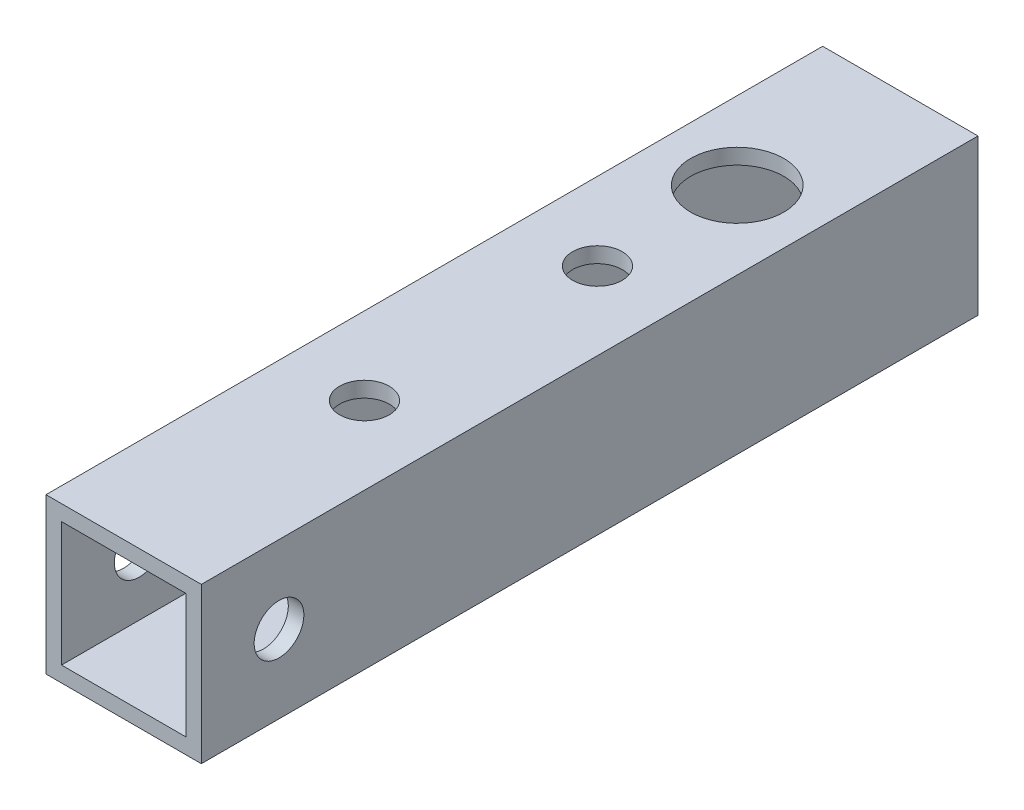
ISO-10303-21;
HEADER;
FILE_DESCRIPTION(('STEP AP214'),'2;1');
FILE_NAME('part.step','',(''),(''),'','','');
FILE_SCHEMA(('AUTOMOTIVE_DESIGN { 1 0 10303 214 1 1 1 1 }'));
ENDSEC;
DATA;
#1=APPLICATION_CONTEXT('core data for automotive mechanical design processes');
#2=APPLICATION_PROTOCOL_DEFINITION('international standard','automotive_design',2000,#1);
#3=PRODUCT_CONTEXT('',#1,'mechanical');
#4=PRODUCT('Part','Part','',(#3));
#5=PRODUCT_RELATED_PRODUCT_CATEGORY('part','',(#4));
#6=PRODUCT_DEFINITION_FORMATION('','',#4);
#7=PRODUCT_DEFINITION_CONTEXT('part definition',#1,'design');
#8=PRODUCT_DEFINITION('design','',#6,#7);
#9=PRODUCT_DEFINITION_SHAPE('','',#8);
#10=(LENGTH_UNIT() NAMED_UNIT(*) SI_UNIT(.MILLI.,.METRE.));
#11=(NAMED_UNIT(*) PLANE_ANGLE_UNIT() SI_UNIT($,.RADIAN.));
#12=(NAMED_UNIT(*) SI_UNIT($,.STERADIAN.) SOLID_ANGLE_UNIT());
#13=UNCERTAINTY_MEASURE_WITH_UNIT(LENGTH_MEASURE(1.E-05),#10,'distance_accuracy_value','');
#14=(GEOMETRIC_REPRESENTATION_CONTEXT(3) GLOBAL_UNCERTAINTY_ASSIGNED_CONTEXT((#13)) GLOBAL_UNIT_ASSIGNED_CONTEXT((#10,
#11,#12)) REPRESENTATION_CONTEXT('',''));
#15=CARTESIAN_POINT('',(0.,0.,0.));
#16=DIRECTION('',(0.,0.,1.));
#17=DIRECTION('',(1.,0.,0.));
#18=AXIS2_PLACEMENT_3D('',#15,#16,#17);
#19=CARTESIAN_POINT('',(0.,0.,50.));
#20=DIRECTION('',(0.,0.,1.));
#21=DIRECTION('',(1.,0.,0.));
#22=AXIS2_PLACEMENT_3D('',#19,#20,#21);
#23=PLANE('',#22);
#24=DIRECTION('',(0.,-1.,0.));
#25=VECTOR('',#24,1.);
#26=CARTESIAN_POINT('',(0.,0.,50.));
#27=LINE('',#26,#25);
#28=CARTESIAN_POINT('',(0.,10.,50.));
#29=VERTEX_POINT('',#28);
#30=CARTESIAN_POINT('',(0.,0.,50.));
#31=VERTEX_POINT('',#30);
#32=EDGE_CURVE('E163',#29,#31,#27,.T.);
#33=ORIENTED_EDGE('',*,*,#32,.T.);
#34=DIRECTION('',(1.,0.,0.));
#35=VECTOR('',#34,1.);
#36=CARTESIAN_POINT('',(0.,0.,50.));
#37=LINE('',#36,#35);
#38=CARTESIAN_POINT('',(10.,0.,50.));
#39=VERTEX_POINT('',#38);
#40=EDGE_CURVE('E166',#31,#39,#37,.T.);
#41=ORIENTED_EDGE('',*,*,#40,.T.);
#42=DIRECTION('',(0.,1.,0.));
#43=VECTOR('',#42,1.);
#44=CARTESIAN_POINT('',(10.,0.,50.));
#45=LINE('',#44,#43);
#46=CARTESIAN_POINT('',(10.,10.,50.));
#47=VERTEX_POINT('',#46);
#48=EDGE_CURVE('E169',#39,#47,#45,.T.);
#49=ORIENTED_EDGE('',*,*,#48,.T.);
#50=DIRECTION('',(-1.,0.,0.));
#51=VECTOR('',#50,1.);
#52=CARTESIAN_POINT('',(0.,10.,50.));
#53=LINE('',#52,#51);
#54=EDGE_CURVE('E171',#47,#29,#53,.T.);
#55=ORIENTED_EDGE('',*,*,#54,.T.);
#56=EDGE_LOOP('',(#33,#41,#49,#55));
#57=FACE_BOUND('',#56,.T.);
#58=DIRECTION('',(1.,0.,0.));
#59=VECTOR('',#58,1.);
#60=CARTESIAN_POINT('',(0.,1.,50.));
#61=LINE('',#60,#59);
#62=CARTESIAN_POINT('',(1.,1.,50.));
#63=VERTEX_POINT('',#62);
#64=CARTESIAN_POINT('',(9.,1.,50.));
#65=VERTEX_POINT('',#64);
#66=EDGE_CURVE('E133',#63,#65,#61,.T.);
#67=ORIENTED_EDGE('',*,*,#66,.F.);
#68=DIRECTION('',(0.,-1.,0.));
#69=VECTOR('',#68,1.);
#70=CARTESIAN_POINT('',(1.,0.,50.));
#71=LINE('',#70,#69);
#72=CARTESIAN_POINT('',(1.,9.,50.));
#73=VERTEX_POINT('',#72);
#74=EDGE_CURVE('E125',#73,#63,#71,.T.);
#75=ORIENTED_EDGE('',*,*,#74,.F.);
#76=DIRECTION('',(-1.,0.,0.));
#77=VECTOR('',#76,1.);
#78=CARTESIAN_POINT('',(0.,9.,50.));
#79=LINE('',#78,#77);
#80=CARTESIAN_POINT('',(9.,9.,50.));
#81=VERTEX_POINT('',#80);
#82=EDGE_CURVE('E147',#81,#73,#79,.T.);
#83=ORIENTED_EDGE('',*,*,#82,.F.);
#84=DIRECTION('',(0.,1.,0.));
#85=VECTOR('',#84,1.);
#86=CARTESIAN_POINT('',(9.,0.,50.));
#87=LINE('',#86,#85);
#88=EDGE_CURVE('E145',#65,#81,#87,.T.);
#89=ORIENTED_EDGE('',*,*,#88,.F.);
#90=EDGE_LOOP('',(#67,#75,#83,#89));
#91=FACE_BOUND('',#90,.T.);
#92=ADVANCED_FACE('F58',(#57,#91),#23,.T.);
#93=CARTESIAN_POINT('',(0.,0.,0.));
#94=DIRECTION('',(0.,0.,1.));
#95=DIRECTION('',(1.,0.,0.));
#96=AXIS2_PLACEMENT_3D('',#93,#94,#95);
#97=PLANE('',#96);
#98=DIRECTION('',(0.,-1.,0.));
#99=VECTOR('',#98,1.);
#100=CARTESIAN_POINT('',(0.,0.,0.));
#101=LINE('',#100,#99);
#102=CARTESIAN_POINT('',(0.,10.,0.));
#103=VERTEX_POINT('',#102);
#104=CARTESIAN_POINT('',(0.,0.,0.));
#105=VERTEX_POINT('',#104);
#106=EDGE_CURVE('E141',#103,#105,#101,.T.);
#107=ORIENTED_EDGE('',*,*,#106,.F.);
#108=DIRECTION('',(-1.,0.,0.));
#109=VECTOR('',#108,1.);
#110=CARTESIAN_POINT('',(0.,10.,0.));
#111=LINE('',#110,#109);
#112=CARTESIAN_POINT('',(10.,10.,0.));
#113=VERTEX_POINT('',#112);
#114=EDGE_CURVE('E167',#113,#103,#111,.T.);
#115=ORIENTED_EDGE('',*,*,#114,.F.);
#116=DIRECTION('',(0.,1.,0.));
#117=VECTOR('',#116,1.);
#118=CARTESIAN_POINT('',(10.,0.,0.));
#119=LINE('',#118,#117);
#120=CARTESIAN_POINT('',(10.,0.,0.));
#121=VERTEX_POINT('',#120);
#122=EDGE_CURVE('E178',#121,#113,#119,.T.);
#123=ORIENTED_EDGE('',*,*,#122,.F.);
#124=DIRECTION('',(1.,0.,0.));
#125=VECTOR('',#124,1.);
#126=CARTESIAN_POINT('',(0.,0.,0.));
#127=LINE('',#126,#125);
#128=EDGE_CURVE('E176',#105,#121,#127,.T.);
#129=ORIENTED_EDGE('',*,*,#128,.F.);
#130=EDGE_LOOP('',(#107,#115,#123,#129));
#131=FACE_BOUND('',#130,.T.);
#132=DIRECTION('',(0.,-1.,0.));
#133=VECTOR('',#132,1.);
#134=CARTESIAN_POINT('',(1.,0.,0.));
#135=LINE('',#134,#133);
#136=CARTESIAN_POINT('',(1.,9.,0.));
#137=VERTEX_POINT('',#136);
#138=CARTESIAN_POINT('',(1.,1.,0.));
#139=VERTEX_POINT('',#138);
#140=EDGE_CURVE('E83',#137,#139,#135,.T.);
#141=ORIENTED_EDGE('',*,*,#140,.T.);
#142=DIRECTION('',(1.,0.,0.));
#143=VECTOR('',#142,1.);
#144=CARTESIAN_POINT('',(0.,1.,0.));
#145=LINE('',#144,#143);
#146=CARTESIAN_POINT('',(9.,1.,0.));
#147=VERTEX_POINT('',#146);
#148=EDGE_CURVE('E140',#139,#147,#145,.T.);
#149=ORIENTED_EDGE('',*,*,#148,.T.);
#150=DIRECTION('',(0.,1.,0.));
#151=VECTOR('',#150,1.);
#152=CARTESIAN_POINT('',(9.,0.,0.));
#153=LINE('',#152,#151);
#154=CARTESIAN_POINT('',(9.,9.,0.));
#155=VERTEX_POINT('',#154);
#156=EDGE_CURVE('E155',#147,#155,#153,.T.);
#157=ORIENTED_EDGE('',*,*,#156,.T.);
#158=DIRECTION('',(-1.,0.,0.));
#159=VECTOR('',#158,1.);
#160=CARTESIAN_POINT('',(0.,9.,0.));
#161=LINE('',#160,#159);
#162=EDGE_CURVE('E134',#155,#137,#161,.T.);
#163=ORIENTED_EDGE('',*,*,#162,.T.);
#164=EDGE_LOOP('',(#141,#149,#157,#163));
#165=FACE_BOUND('',#164,.T.);
#166=ADVANCED_FACE('F248',(#131,#165),#97,.F.);
#167=CARTESIAN_POINT('',(0.,0.,50.));
#168=DIRECTION('',(1.,0.,0.));
#169=DIRECTION('',(0.,0.,-1.));
#170=AXIS2_PLACEMENT_3D('',#167,#168,#169);
#171=PLANE('',#170);
#172=CARTESIAN_POINT('',(0.,5.,45.));
#173=DIRECTION('',(1.,0.,0.));
#174=DIRECTION('',(0.,1.,0.));
#175=AXIS2_PLACEMENT_3D('',#172,#173,#174);
#176=CIRCLE('',#175,1.6);
#177=CARTESIAN_POINT('',(0.,6.6,45.));
#178=VERTEX_POINT('',#177);
#179=EDGE_CURVE('E231',#178,#178,#176,.T.);
#180=ORIENTED_EDGE('',*,*,#179,.T.);
#181=EDGE_LOOP('',(#180));
#182=FACE_BOUND('',#181,.T.);
#183=ORIENTED_EDGE('',*,*,#106,.T.);
#184=DIRECTION('',(0.,0.,-1.));
#185=VECTOR('',#184,1.);
#186=CARTESIAN_POINT('',(0.,0.,50.));
#187=LINE('',#186,#185);
#188=EDGE_CURVE('E12',#31,#105,#187,.T.);
#189=ORIENTED_EDGE('',*,*,#188,.F.);
#190=ORIENTED_EDGE('',*,*,#32,.F.);
#191=DIRECTION('',(0.,0.,-1.));
#192=VECTOR('',#191,1.);
#193=CARTESIAN_POINT('',(0.,10.,50.));
#194=LINE('',#193,#192);
#195=EDGE_CURVE('E173',#29,#103,#194,.T.);
#196=ORIENTED_EDGE('',*,*,#195,.T.);
#197=EDGE_LOOP('',(#183,#189,#190,#196));
#198=FACE_BOUND('',#197,.T.);
#199=ADVANCED_FACE('F60',(#182,#198),#171,.F.);
#200=CARTESIAN_POINT('',(0.,0.,50.));
#201=DIRECTION('',(0.,1.,0.));
#202=DIRECTION('',(0.,0.,1.));
#203=AXIS2_PLACEMENT_3D('',#200,#201,#202);
#204=PLANE('',#203);
#205=CARTESIAN_POINT('',(5.,0.,19.5));
#206=DIRECTION('',(0.,-1.,0.));
#207=DIRECTION('',(0.,0.,-1.));
#208=AXIS2_PLACEMENT_3D('',#205,#206,#207);
#209=CIRCLE('',#208,2.6);
#210=CARTESIAN_POINT('',(5.,0.,16.9));
#211=VERTEX_POINT('',#210);
#212=EDGE_CURVE('E209',#211,#211,#209,.T.);
#213=ORIENTED_EDGE('',*,*,#212,.F.);
#214=EDGE_LOOP('',(#213));
#215=FACE_BOUND('',#214,.T.);
#216=CARTESIAN_POINT('',(5.,0.,10.5));
#217=DIRECTION('',(0.,1.,0.));
#218=DIRECTION('',(0.,0.,1.));
#219=AXIS2_PLACEMENT_3D('',#216,#217,#218);
#220=CIRCLE('',#219,3.);
#221=CARTESIAN_POINT('',(5.,0.,13.5));
#222=VERTEX_POINT('',#221);
#223=EDGE_CURVE('E192',#222,#222,#220,.T.);
#224=ORIENTED_EDGE('',*,*,#223,.T.);
#225=EDGE_LOOP('',(#224));
#226=FACE_BOUND('',#225,.T.);
#227=CARTESIAN_POINT('',(5.,0.,34.5));
#228=DIRECTION('',(0.,1.,0.));
#229=DIRECTION('',(0.,0.,1.));
#230=AXIS2_PLACEMENT_3D('',#227,#228,#229);
#231=CIRCLE('',#230,1.6);
#232=CARTESIAN_POINT('',(5.,0.,36.1));
#233=VERTEX_POINT('',#232);
#234=EDGE_CURVE('E208',#233,#233,#231,.T.);
#235=ORIENTED_EDGE('',*,*,#234,.T.);
#236=EDGE_LOOP('',(#235));
#237=FACE_BOUND('',#236,.T.);
#238=ORIENTED_EDGE('',*,*,#128,.T.);
#239=DIRECTION('',(0.,0.,-1.));
#240=VECTOR('',#239,1.);
#241=CARTESIAN_POINT('',(10.,0.,50.));
#242=LINE('',#241,#240);
#243=EDGE_CURVE('E67',#39,#121,#242,.T.);
#244=ORIENTED_EDGE('',*,*,#243,.F.);
#245=ORIENTED_EDGE('',*,*,#40,.F.);
#246=ORIENTED_EDGE('',*,*,#188,.T.);
#247=EDGE_LOOP('',(#238,#244,#245,#246));
#248=FACE_BOUND('',#247,.T.);
#249=ADVANCED_FACE('F278',(#215,#226,#237,#248),#204,.F.);
#250=CARTESIAN_POINT('',(10.,0.,50.));
#251=DIRECTION('',(-1.,0.,0.));
#252=DIRECTION('',(0.,-1.,0.));
#253=AXIS2_PLACEMENT_3D('',#250,#251,#252);
#254=PLANE('',#253);
#255=CARTESIAN_POINT('',(10.,5.,45.));
#256=DIRECTION('',(1.,0.,0.));
#257=DIRECTION('',(0.,1.,0.));
#258=AXIS2_PLACEMENT_3D('',#255,#256,#257);
#259=CIRCLE('',#258,1.6);
#260=CARTESIAN_POINT('',(10.,6.6,45.));
#261=VERTEX_POINT('',#260);
#262=EDGE_CURVE('E228',#261,#261,#259,.T.);
#263=ORIENTED_EDGE('',*,*,#262,.F.);
#264=EDGE_LOOP('',(#263));
#265=FACE_BOUND('',#264,.T.);
#266=ORIENTED_EDGE('',*,*,#122,.T.);
#267=DIRECTION('',(0.,0.,-1.));
#268=VECTOR('',#267,1.);
#269=CARTESIAN_POINT('',(10.,10.,50.));
#270=LINE('',#269,#268);
#271=EDGE_CURVE('E183',#47,#113,#270,.T.);
#272=ORIENTED_EDGE('',*,*,#271,.F.);
#273=ORIENTED_EDGE('',*,*,#48,.F.);
#274=ORIENTED_EDGE('',*,*,#243,.T.);
#275=EDGE_LOOP('',(#266,#272,#273,#274));
#276=FACE_BOUND('',#275,.T.);
#277=ADVANCED_FACE('F275',(#265,#276),#254,.F.);
#278=CARTESIAN_POINT('',(0.,10.,50.));
#279=DIRECTION('',(0.,-1.,0.));
#280=DIRECTION('',(0.,0.,-1.));
#281=AXIS2_PLACEMENT_3D('',#278,#279,#280);
#282=PLANE('',#281);
#283=CARTESIAN_POINT('',(5.,10.,10.5));
#284=DIRECTION('',(0.,1.,0.));
#285=DIRECTION('',(0.,0.,1.));
#286=AXIS2_PLACEMENT_3D('',#283,#284,#285);
#287=CIRCLE('',#286,3.);
#288=CARTESIAN_POINT('',(5.,10.,13.5));
#289=VERTEX_POINT('',#288);
#290=EDGE_CURVE('E215',#289,#289,#287,.T.);
#291=ORIENTED_EDGE('',*,*,#290,.F.);
#292=EDGE_LOOP('',(#291));
#293=FACE_BOUND('',#292,.T.);
#294=CARTESIAN_POINT('',(5.,10.,19.5));
#295=DIRECTION('',(0.,1.,0.));
#296=DIRECTION('',(0.,0.,1.));
#297=AXIS2_PLACEMENT_3D('',#294,#295,#296);
#298=CIRCLE('',#297,1.6);
#299=CARTESIAN_POINT('',(5.,10.,21.1));
#300=VERTEX_POINT('',#299);
#301=EDGE_CURVE('E212',#300,#300,#298,.T.);
#302=ORIENTED_EDGE('',*,*,#301,.F.);
#303=EDGE_LOOP('',(#302));
#304=FACE_BOUND('',#303,.T.);
#305=CARTESIAN_POINT('',(5.,10.,34.5));
#306=DIRECTION('',(0.,1.,0.));
#307=DIRECTION('',(0.,0.,1.));
#308=AXIS2_PLACEMENT_3D('',#305,#306,#307);
#309=CIRCLE('',#308,1.6);
#310=CARTESIAN_POINT('',(5.,10.,36.1));
#311=VERTEX_POINT('',#310);
#312=EDGE_CURVE('E205',#311,#311,#309,.T.);
#313=ORIENTED_EDGE('',*,*,#312,.F.);
#314=EDGE_LOOP('',(#313));
#315=FACE_BOUND('',#314,.T.);
#316=ORIENTED_EDGE('',*,*,#114,.T.);
#317=ORIENTED_EDGE('',*,*,#195,.F.);
#318=ORIENTED_EDGE('',*,*,#54,.F.);
#319=ORIENTED_EDGE('',*,*,#271,.T.);
#320=EDGE_LOOP('',(#316,#317,#318,#319));
#321=FACE_BOUND('',#320,.T.);
#322=ADVANCED_FACE('F272',(#293,#304,#315,#321),#282,.F.);
#323=CARTESIAN_POINT('',(1.,0.,50.));
#324=DIRECTION('',(1.,0.,0.));
#325=DIRECTION('',(0.,0.,-1.));
#326=AXIS2_PLACEMENT_3D('',#323,#324,#325);
#327=PLANE('',#326);
#328=CARTESIAN_POINT('',(1.,5.,45.));
#329=DIRECTION('',(1.,0.,0.));
#330=DIRECTION('',(0.,0.,-1.));
#331=AXIS2_PLACEMENT_3D('',#328,#329,#330);
#332=CIRCLE('',#331,1.6);
#333=CARTESIAN_POINT('',(1.,5.,43.4));
#334=VERTEX_POINT('',#333);
#335=EDGE_CURVE('E223',#334,#334,#332,.T.);
#336=ORIENTED_EDGE('',*,*,#335,.F.);
#337=EDGE_LOOP('',(#336));
#338=FACE_BOUND('',#337,.T.);
#339=ORIENTED_EDGE('',*,*,#140,.F.);
#340=DIRECTION('',(0.,0.,-1.));
#341=VECTOR('',#340,1.);
#342=CARTESIAN_POINT('',(1.,9.,50.));
#343=LINE('',#342,#341);
#344=EDGE_CURVE('E129',#73,#137,#343,.T.);
#345=ORIENTED_EDGE('',*,*,#344,.F.);
#346=ORIENTED_EDGE('',*,*,#74,.T.);
#347=DIRECTION('',(0.,0.,-1.));
#348=VECTOR('',#347,1.);
#349=CARTESIAN_POINT('',(1.,1.,50.));
#350=LINE('',#349,#348);
#351=EDGE_CURVE('E128',#63,#139,#350,.T.);
#352=ORIENTED_EDGE('',*,*,#351,.T.);
#353=EDGE_LOOP('',(#339,#345,#346,#352));
#354=FACE_BOUND('',#353,.T.);
#355=ADVANCED_FACE('F127',(#338,#354),#327,.T.);
#356=CARTESIAN_POINT('',(0.,1.,50.));
#357=DIRECTION('',(0.,1.,0.));
#358=DIRECTION('',(0.,0.,1.));
#359=AXIS2_PLACEMENT_3D('',#356,#357,#358);
#360=PLANE('',#359);
#361=CARTESIAN_POINT('',(5.,1.,19.5));
#362=DIRECTION('',(0.,1.,0.));
#363=DIRECTION('',(0.,0.,1.));
#364=AXIS2_PLACEMENT_3D('',#361,#362,#363);
#365=CIRCLE('',#364,2.6);
#366=CARTESIAN_POINT('',(5.,1.,22.1));
#367=VERTEX_POINT('',#366);
#368=EDGE_CURVE('E220',#367,#367,#365,.F.);
#369=ORIENTED_EDGE('',*,*,#368,.T.);
#370=EDGE_LOOP('',(#369));
#371=FACE_BOUND('',#370,.T.);
#372=CARTESIAN_POINT('',(5.,1.,10.5));
#373=DIRECTION('',(0.,1.,0.));
#374=DIRECTION('',(0.,0.,1.));
#375=AXIS2_PLACEMENT_3D('',#372,#373,#374);
#376=CIRCLE('',#375,3.);
#377=CARTESIAN_POINT('',(5.,1.,13.5));
#378=VERTEX_POINT('',#377);
#379=EDGE_CURVE('E153',#378,#378,#376,.T.);
#380=ORIENTED_EDGE('',*,*,#379,.F.);
#381=EDGE_LOOP('',(#380));
#382=FACE_BOUND('',#381,.T.);
#383=CARTESIAN_POINT('',(5.,1.,34.5));
#384=DIRECTION('',(0.,1.,0.));
#385=DIRECTION('',(0.,0.,1.));
#386=AXIS2_PLACEMENT_3D('',#383,#384,#385);
#387=CIRCLE('',#386,1.6);
#388=CARTESIAN_POINT('',(5.,1.,36.1));
#389=VERTEX_POINT('',#388);
#390=EDGE_CURVE('E191',#389,#389,#387,.T.);
#391=ORIENTED_EDGE('',*,*,#390,.F.);
#392=EDGE_LOOP('',(#391));
#393=FACE_BOUND('',#392,.T.);
#394=ORIENTED_EDGE('',*,*,#148,.F.);
#395=ORIENTED_EDGE('',*,*,#351,.F.);
#396=ORIENTED_EDGE('',*,*,#66,.T.);
#397=DIRECTION('',(0.,0.,-1.));
#398=VECTOR('',#397,1.);
#399=CARTESIAN_POINT('',(9.,1.,50.));
#400=LINE('',#399,#398);
#401=EDGE_CURVE('E142',#65,#147,#400,.T.);
#402=ORIENTED_EDGE('',*,*,#401,.T.);
#403=EDGE_LOOP('',(#394,#395,#396,#402));
#404=FACE_BOUND('',#403,.T.);
#405=ADVANCED_FACE('F137',(#371,#382,#393,#404),#360,.T.);
#406=CARTESIAN_POINT('',(9.,0.,50.));
#407=DIRECTION('',(-1.,0.,0.));
#408=DIRECTION('',(0.,-1.,0.));
#409=AXIS2_PLACEMENT_3D('',#406,#407,#408);
#410=PLANE('',#409);
#411=CARTESIAN_POINT('',(9.,5.,45.));
#412=DIRECTION('',(-1.,0.,0.));
#413=DIRECTION('',(0.,-1.,0.));
#414=AXIS2_PLACEMENT_3D('',#411,#412,#413);
#415=CIRCLE('',#414,1.6);
#416=CARTESIAN_POINT('',(9.,3.4,45.));
#417=VERTEX_POINT('',#416);
#418=EDGE_CURVE('E62',#417,#417,#415,.T.);
#419=ORIENTED_EDGE('',*,*,#418,.F.);
#420=EDGE_LOOP('',(#419));
#421=FACE_BOUND('',#420,.T.);
#422=ORIENTED_EDGE('',*,*,#156,.F.);
#423=ORIENTED_EDGE('',*,*,#401,.F.);
#424=ORIENTED_EDGE('',*,*,#88,.T.);
#425=DIRECTION('',(0.,0.,-1.));
#426=VECTOR('',#425,1.);
#427=CARTESIAN_POINT('',(9.,9.,50.));
#428=LINE('',#427,#426);
#429=EDGE_CURVE('E75',#81,#155,#428,.T.);
#430=ORIENTED_EDGE('',*,*,#429,.T.);
#431=EDGE_LOOP('',(#422,#423,#424,#430));
#432=FACE_BOUND('',#431,.T.);
#433=ADVANCED_FACE('F241',(#421,#432),#410,.T.);
#434=CARTESIAN_POINT('',(0.,9.,50.));
#435=DIRECTION('',(0.,-1.,0.));
#436=DIRECTION('',(0.,0.,-1.));
#437=AXIS2_PLACEMENT_3D('',#434,#435,#436);
#438=PLANE('',#437);
#439=CARTESIAN_POINT('',(5.,9.,10.5));
#440=DIRECTION('',(0.,-1.,0.));
#441=DIRECTION('',(0.,0.,-1.));
#442=AXIS2_PLACEMENT_3D('',#439,#440,#441);
#443=CIRCLE('',#442,3.);
#444=CARTESIAN_POINT('',(5.,9.,7.5));
#445=VERTEX_POINT('',#444);
#446=EDGE_CURVE('E195',#445,#445,#443,.T.);
#447=ORIENTED_EDGE('',*,*,#446,.F.);
#448=EDGE_LOOP('',(#447));
#449=FACE_BOUND('',#448,.T.);
#450=CARTESIAN_POINT('',(5.,9.,19.5));
#451=DIRECTION('',(0.,-1.,0.));
#452=DIRECTION('',(0.,0.,-1.));
#453=AXIS2_PLACEMENT_3D('',#450,#451,#452);
#454=CIRCLE('',#453,1.6);
#455=CARTESIAN_POINT('',(5.,9.,17.9));
#456=VERTEX_POINT('',#455);
#457=EDGE_CURVE('E193',#456,#456,#454,.T.);
#458=ORIENTED_EDGE('',*,*,#457,.F.);
#459=EDGE_LOOP('',(#458));
#460=FACE_BOUND('',#459,.T.);
#461=CARTESIAN_POINT('',(5.,9.,34.5));
#462=DIRECTION('',(0.,-1.,0.));
#463=DIRECTION('',(0.,0.,-1.));
#464=AXIS2_PLACEMENT_3D('',#461,#462,#463);
#465=CIRCLE('',#464,1.6);
#466=CARTESIAN_POINT('',(5.,9.,32.9));
#467=VERTEX_POINT('',#466);
#468=EDGE_CURVE('E188',#467,#467,#465,.T.);
#469=ORIENTED_EDGE('',*,*,#468,.F.);
#470=EDGE_LOOP('',(#469));
#471=FACE_BOUND('',#470,.T.);
#472=ORIENTED_EDGE('',*,*,#162,.F.);
#473=ORIENTED_EDGE('',*,*,#429,.F.);
#474=ORIENTED_EDGE('',*,*,#82,.T.);
#475=ORIENTED_EDGE('',*,*,#344,.T.);
#476=EDGE_LOOP('',(#472,#473,#474,#475));
#477=FACE_BOUND('',#476,.T.);
#478=ADVANCED_FACE('F244',(#449,#460,#471,#477),#438,.T.);
#479=CARTESIAN_POINT('',(5.,0.,34.5));
#480=DIRECTION('',(0.,1.,0.));
#481=DIRECTION('',(0.,0.,1.));
#482=AXIS2_PLACEMENT_3D('',#479,#480,#481);
#483=CYLINDRICAL_SURFACE('',#482,1.6);
#484=ORIENTED_EDGE('',*,*,#468,.T.);
#485=EDGE_LOOP('',(#484));
#486=FACE_BOUND('',#485,.T.);
#487=ORIENTED_EDGE('',*,*,#312,.T.);
#488=EDGE_LOOP('',(#487));
#489=FACE_BOUND('',#488,.T.);
#490=ADVANCED_FACE('F250',(#486,#489),#483,.F.);
#491=CARTESIAN_POINT('',(5.,0.,19.5));
#492=DIRECTION('',(0.,1.,0.));
#493=DIRECTION('',(0.,0.,1.));
#494=AXIS2_PLACEMENT_3D('',#491,#492,#493);
#495=CYLINDRICAL_SURFACE('',#494,1.6);
#496=ORIENTED_EDGE('',*,*,#457,.T.);
#497=EDGE_LOOP('',(#496));
#498=FACE_BOUND('',#497,.T.);
#499=ORIENTED_EDGE('',*,*,#301,.T.);
#500=EDGE_LOOP('',(#499));
#501=FACE_BOUND('',#500,.T.);
#502=ADVANCED_FACE('F256',(#498,#501),#495,.F.);
#503=CARTESIAN_POINT('',(5.,0.,10.5));
#504=DIRECTION('',(0.,1.,0.));
#505=DIRECTION('',(0.,0.,1.));
#506=AXIS2_PLACEMENT_3D('',#503,#504,#505);
#507=CYLINDRICAL_SURFACE('',#506,3.);
#508=ORIENTED_EDGE('',*,*,#446,.T.);
#509=EDGE_LOOP('',(#508));
#510=FACE_BOUND('',#509,.T.);
#511=ORIENTED_EDGE('',*,*,#290,.T.);
#512=EDGE_LOOP('',(#511));
#513=FACE_BOUND('',#512,.T.);
#514=ADVANCED_FACE('F307',(#510,#513),#507,.F.);
#515=ORIENTED_EDGE('',*,*,#390,.T.);
#516=EDGE_LOOP('',(#515));
#517=FACE_BOUND('',#516,.T.);
#518=ORIENTED_EDGE('',*,*,#234,.F.);
#519=EDGE_LOOP('',(#518));
#520=FACE_BOUND('',#519,.T.);
#521=ADVANCED_FACE('F259',(#517,#520),#483,.F.);
#522=ORIENTED_EDGE('',*,*,#379,.T.);
#523=EDGE_LOOP('',(#522));
#524=FACE_BOUND('',#523,.T.);
#525=ORIENTED_EDGE('',*,*,#223,.F.);
#526=EDGE_LOOP('',(#525));
#527=FACE_BOUND('',#526,.T.);
#528=ADVANCED_FACE('F306',(#524,#527),#507,.F.);
#529=CARTESIAN_POINT('',(5.,10.001,19.5));
#530=DIRECTION('',(0.,-1.,0.));
#531=DIRECTION('',(0.,0.,-1.));
#532=AXIS2_PLACEMENT_3D('',#529,#530,#531);
#533=CYLINDRICAL_SURFACE('',#532,2.6);
#534=ORIENTED_EDGE('',*,*,#368,.F.);
#535=EDGE_LOOP('',(#534));
#536=FACE_BOUND('',#535,.T.);
#537=ORIENTED_EDGE('',*,*,#212,.T.);
#538=EDGE_LOOP('',(#537));
#539=FACE_BOUND('',#538,.T.);
#540=ADVANCED_FACE('F313',(#536,#539),#533,.F.);
#541=CARTESIAN_POINT('',(0.,5.,45.));
#542=DIRECTION('',(1.,0.,0.));
#543=DIRECTION('',(0.,1.,0.));
#544=AXIS2_PLACEMENT_3D('',#541,#542,#543);
#545=CYLINDRICAL_SURFACE('',#544,1.6);
#546=ORIENTED_EDGE('',*,*,#418,.T.);
#547=EDGE_LOOP('',(#546));
#548=FACE_BOUND('',#547,.T.);
#549=ORIENTED_EDGE('',*,*,#262,.T.);
#550=EDGE_LOOP('',(#549));
#551=FACE_BOUND('',#550,.T.);
#552=ADVANCED_FACE('F238',(#548,#551),#545,.F.);
#553=ORIENTED_EDGE('',*,*,#335,.T.);
#554=EDGE_LOOP('',(#553));
#555=FACE_BOUND('',#554,.T.);
#556=ORIENTED_EDGE('',*,*,#179,.F.);
#557=EDGE_LOOP('',(#556));
#558=FACE_BOUND('',#557,.T.);
#559=ADVANCED_FACE('F323',(#555,#558),#545,.F.);
#560=CLOSED_SHELL('',(#92,#166,#199,#249,#277,#322,#355,#405,#433,#478,#490,#502,#514,#521,#528,
#540,#552,#559));
#561=MANIFOLD_SOLID_BREP('B2',#560);
#562=ADVANCED_BREP_SHAPE_REPRESENTATION('',(#18,#561),#14);
#563=SHAPE_DEFINITION_REPRESENTATION(#9,#562);
ENDSEC;
END-ISO-10303-21;
